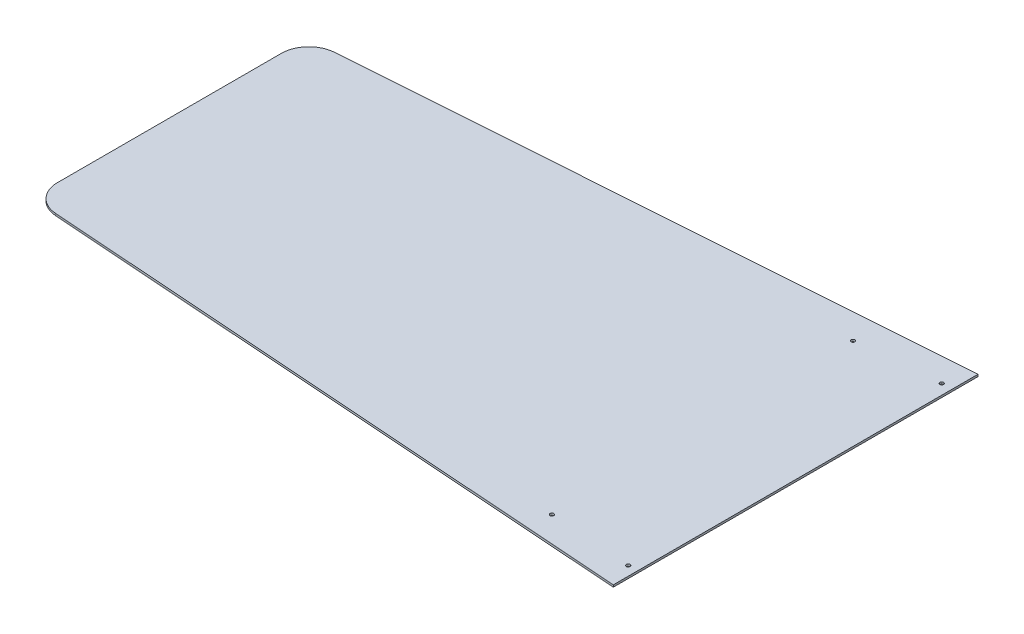
ISO-10303-21;
HEADER;
FILE_DESCRIPTION(('STEP AP214'),'2;1');
FILE_NAME('part.step','',(''),(''),'','','');
FILE_SCHEMA(('AUTOMOTIVE_DESIGN { 1 0 10303 214 1 1 1 1 }'));
ENDSEC;
DATA;
#1=APPLICATION_CONTEXT('core data for automotive mechanical design processes');
#2=APPLICATION_PROTOCOL_DEFINITION('international standard','automotive_design',2000,#1);
#3=PRODUCT_CONTEXT('',#1,'mechanical');
#4=PRODUCT('Part','Part','',(#3));
#5=PRODUCT_RELATED_PRODUCT_CATEGORY('part','',(#4));
#6=PRODUCT_DEFINITION_FORMATION('','',#4);
#7=PRODUCT_DEFINITION_CONTEXT('part definition',#1,'design');
#8=PRODUCT_DEFINITION('design','',#6,#7);
#9=PRODUCT_DEFINITION_SHAPE('','',#8);
#10=(LENGTH_UNIT() NAMED_UNIT(*) SI_UNIT(.MILLI.,.METRE.));
#11=(NAMED_UNIT(*) PLANE_ANGLE_UNIT() SI_UNIT($,.RADIAN.));
#12=(NAMED_UNIT(*) SI_UNIT($,.STERADIAN.) SOLID_ANGLE_UNIT());
#13=UNCERTAINTY_MEASURE_WITH_UNIT(LENGTH_MEASURE(1.E-05),#10,'distance_accuracy_value','');
#14=(GEOMETRIC_REPRESENTATION_CONTEXT(3) GLOBAL_UNCERTAINTY_ASSIGNED_CONTEXT((#13)) GLOBAL_UNIT_ASSIGNED_CONTEXT((#10,
#11,#12)) REPRESENTATION_CONTEXT('',''));
#15=CARTESIAN_POINT('',(0.,0.,0.));
#16=DIRECTION('',(0.,0.,1.));
#17=DIRECTION('',(1.,0.,0.));
#18=AXIS2_PLACEMENT_3D('',#15,#16,#17);
#19=CARTESIAN_POINT('',(37.1501180004836,3.,-202.653579857177));
#20=DIRECTION('',(0.0712470499879097,0.,0.997458699830735));
#21=DIRECTION('',(0.997458699830735,0.,-0.0712470499879097));
#22=AXIS2_PLACEMENT_3D('',#19,#20,#21);
#23=PLANE('',#22);
#24=DIRECTION('',(-0.997458699830735,0.,0.0712470499879097));
#25=VECTOR('',#24,1.);
#26=CARTESIAN_POINT('',(37.1501180004836,0.,-202.653579857177));
#27=LINE('',#26,#25);
#28=CARTESIAN_POINT('',(910.,0.,-265.));
#29=VERTEX_POINT('',#28);
#30=CARTESIAN_POINT('',(37.1501180004836,0.,-202.653579857177));
#31=VERTEX_POINT('',#30);
#32=EDGE_CURVE('E122',#29,#31,#27,.T.);
#33=ORIENTED_EDGE('',*,*,#32,.T.);
#34=DIRECTION('',(0.,-1.,0.));
#35=VECTOR('',#34,1.);
#36=CARTESIAN_POINT('',(37.1501180004836,3.,-202.653579857177));
#37=LINE('',#36,#35);
#38=CARTESIAN_POINT('',(37.1501180004836,3.,-202.653579857177));
#39=VERTEX_POINT('',#38);
#40=EDGE_CURVE('E11',#39,#31,#37,.T.);
#41=ORIENTED_EDGE('',*,*,#40,.F.);
#42=DIRECTION('',(-0.997458699830735,0.,0.0712470499879097));
#43=VECTOR('',#42,1.);
#44=CARTESIAN_POINT('',(37.1501180004836,3.,-202.653579857177));
#45=LINE('',#44,#43);
#46=CARTESIAN_POINT('',(910.,3.,-265.));
#47=VERTEX_POINT('',#46);
#48=EDGE_CURVE('E132',#47,#39,#45,.T.);
#49=ORIENTED_EDGE('',*,*,#48,.F.);
#50=DIRECTION('',(0.,-1.,0.));
#51=VECTOR('',#50,1.);
#52=CARTESIAN_POINT('',(910.,3.,-265.));
#53=LINE('',#52,#51);
#54=EDGE_CURVE('E118',#47,#29,#53,.T.);
#55=ORIENTED_EDGE('',*,*,#54,.T.);
#56=EDGE_LOOP('',(#33,#41,#49,#55));
#57=FACE_BOUND('',#56,.T.);
#58=ADVANCED_FACE('F36',(#57),#23,.F.);
#59=CARTESIAN_POINT('',(40.,3.,-162.755231863948));
#60=DIRECTION('',(0.,-1.,0.));
#61=DIRECTION('',(0.,0.,-1.));
#62=AXIS2_PLACEMENT_3D('',#59,#60,#61);
#63=CYLINDRICAL_SURFACE('',#62,39.9999999999999);
#64=CARTESIAN_POINT('',(40.,0.,-162.755231863948));
#65=DIRECTION('',(0.,1.,0.));
#66=DIRECTION('',(0.,0.,-1.));
#67=AXIS2_PLACEMENT_3D('',#64,#65,#66);
#68=CIRCLE('',#67,39.9999999999999);
#69=CARTESIAN_POINT('',(0.,0.,-162.755231863948));
#70=VERTEX_POINT('',#69);
#71=EDGE_CURVE('E125',#31,#70,#68,.T.);
#72=ORIENTED_EDGE('',*,*,#71,.T.);
#73=DIRECTION('',(0.,-1.,0.));
#74=VECTOR('',#73,1.);
#75=CARTESIAN_POINT('',(0.,3.,-162.755231863948));
#76=LINE('',#75,#74);
#77=CARTESIAN_POINT('',(0.,3.,-162.755231863948));
#78=VERTEX_POINT('',#77);
#79=EDGE_CURVE('E45',#78,#70,#76,.T.);
#80=ORIENTED_EDGE('',*,*,#79,.F.);
#81=CARTESIAN_POINT('',(40.,3.,-162.755231863948));
#82=DIRECTION('',(0.,1.,0.));
#83=DIRECTION('',(0.,0.,-1.));
#84=AXIS2_PLACEMENT_3D('',#81,#82,#83);
#85=CIRCLE('',#84,39.9999999999999);
#86=EDGE_CURVE('E91',#39,#78,#85,.T.);
#87=ORIENTED_EDGE('',*,*,#86,.F.);
#88=ORIENTED_EDGE('',*,*,#40,.T.);
#89=EDGE_LOOP('',(#72,#80,#87,#88));
#90=FACE_BOUND('',#89,.T.);
#91=ADVANCED_FACE('F167',(#90),#63,.T.);
#92=CARTESIAN_POINT('',(0.,3.,-162.755231863948));
#93=DIRECTION('',(1.,0.,0.));
#94=DIRECTION('',(0.,0.,-1.));
#95=AXIS2_PLACEMENT_3D('',#92,#93,#94);
#96=PLANE('',#95);
#97=DIRECTION('',(0.,0.,1.));
#98=VECTOR('',#97,1.);
#99=CARTESIAN_POINT('',(0.,0.,-162.755231863948));
#100=LINE('',#99,#98);
#101=CARTESIAN_POINT('',(1.11022302462516E-13,0.,162.755231863948));
#102=VERTEX_POINT('',#101);
#103=EDGE_CURVE('E127',#70,#102,#100,.T.);
#104=ORIENTED_EDGE('',*,*,#103,.T.);
#105=DIRECTION('',(0.,-1.,0.));
#106=VECTOR('',#105,1.);
#107=CARTESIAN_POINT('',(1.11022302462516E-13,3.,162.755231863948));
#108=LINE('',#107,#106);
#109=CARTESIAN_POINT('',(1.11022302462516E-13,3.,162.755231863948));
#110=VERTEX_POINT('',#109);
#111=EDGE_CURVE('E113',#110,#102,#108,.T.);
#112=ORIENTED_EDGE('',*,*,#111,.F.);
#113=DIRECTION('',(0.,0.,1.));
#114=VECTOR('',#113,1.);
#115=CARTESIAN_POINT('',(0.,3.,-162.755231863948));
#116=LINE('',#115,#114);
#117=EDGE_CURVE('E104',#78,#110,#116,.T.);
#118=ORIENTED_EDGE('',*,*,#117,.F.);
#119=ORIENTED_EDGE('',*,*,#79,.T.);
#120=EDGE_LOOP('',(#104,#112,#118,#119));
#121=FACE_BOUND('',#120,.T.);
#122=ADVANCED_FACE('F172',(#121),#96,.F.);
#123=CARTESIAN_POINT('',(40.,3.,162.755231863948));
#124=DIRECTION('',(0.,-1.,0.));
#125=DIRECTION('',(0.,0.,-1.));
#126=AXIS2_PLACEMENT_3D('',#123,#124,#125);
#127=CYLINDRICAL_SURFACE('',#126,39.9999999999999);
#128=CARTESIAN_POINT('',(40.,0.,162.755231863948));
#129=DIRECTION('',(0.,1.,0.));
#130=DIRECTION('',(0.,0.,1.));
#131=AXIS2_PLACEMENT_3D('',#128,#129,#130);
#132=CIRCLE('',#131,39.9999999999999);
#133=CARTESIAN_POINT('',(37.1501180004836,0.,202.653579857177));
#134=VERTEX_POINT('',#133);
#135=EDGE_CURVE('E112',#102,#134,#132,.T.);
#136=ORIENTED_EDGE('',*,*,#135,.T.);
#137=DIRECTION('',(0.,-1.,0.));
#138=VECTOR('',#137,1.);
#139=CARTESIAN_POINT('',(37.1501180004836,3.,202.653579857177));
#140=LINE('',#139,#138);
#141=CARTESIAN_POINT('',(37.1501180004836,3.,202.653579857177));
#142=VERTEX_POINT('',#141);
#143=EDGE_CURVE('E109',#142,#134,#140,.T.);
#144=ORIENTED_EDGE('',*,*,#143,.F.);
#145=CARTESIAN_POINT('',(40.,3.,162.755231863948));
#146=DIRECTION('',(0.,1.,0.));
#147=DIRECTION('',(0.,0.,1.));
#148=AXIS2_PLACEMENT_3D('',#145,#146,#147);
#149=CIRCLE('',#148,39.9999999999999);
#150=EDGE_CURVE('E98',#110,#142,#149,.T.);
#151=ORIENTED_EDGE('',*,*,#150,.F.);
#152=ORIENTED_EDGE('',*,*,#111,.T.);
#153=EDGE_LOOP('',(#136,#144,#151,#152));
#154=FACE_BOUND('',#153,.T.);
#155=ADVANCED_FACE('F110',(#154),#127,.T.);
#156=CARTESIAN_POINT('',(37.1501180004836,3.,202.653579857177));
#157=DIRECTION('',(0.0712470499879097,0.,-0.997458699830735));
#158=DIRECTION('',(-0.997458699830735,0.,-0.0712470499879097));
#159=AXIS2_PLACEMENT_3D('',#156,#157,#158);
#160=PLANE('',#159);
#161=DIRECTION('',(0.997458699830735,0.,0.0712470499879097));
#162=VECTOR('',#161,1.);
#163=CARTESIAN_POINT('',(37.1501180004836,0.,202.653579857177));
#164=LINE('',#163,#162);
#165=CARTESIAN_POINT('',(910.,0.,265.));
#166=VERTEX_POINT('',#165);
#167=EDGE_CURVE('E77',#134,#166,#164,.T.);
#168=ORIENTED_EDGE('',*,*,#167,.T.);
#169=DIRECTION('',(0.,-1.,0.));
#170=VECTOR('',#169,1.);
#171=CARTESIAN_POINT('',(910.,3.,265.));
#172=LINE('',#171,#170);
#173=CARTESIAN_POINT('',(910.,3.,265.));
#174=VERTEX_POINT('',#173);
#175=EDGE_CURVE('E114',#174,#166,#172,.T.);
#176=ORIENTED_EDGE('',*,*,#175,.F.);
#177=DIRECTION('',(0.997458699830735,0.,0.0712470499879097));
#178=VECTOR('',#177,1.);
#179=CARTESIAN_POINT('',(37.1501180004836,3.,202.653579857177));
#180=LINE('',#179,#178);
#181=EDGE_CURVE('E102',#142,#174,#180,.T.);
#182=ORIENTED_EDGE('',*,*,#181,.F.);
#183=ORIENTED_EDGE('',*,*,#143,.T.);
#184=EDGE_LOOP('',(#168,#176,#182,#183));
#185=FACE_BOUND('',#184,.T.);
#186=ADVANCED_FACE('F116',(#185),#160,.F.);
#187=CARTESIAN_POINT('',(910.,3.,-265.));
#188=DIRECTION('',(-1.,0.,0.));
#189=DIRECTION('',(0.,0.,1.));
#190=AXIS2_PLACEMENT_3D('',#187,#188,#189);
#191=PLANE('',#190);
#192=DIRECTION('',(0.,0.,-1.));
#193=VECTOR('',#192,1.);
#194=CARTESIAN_POINT('',(910.,0.,-265.));
#195=LINE('',#194,#193);
#196=EDGE_CURVE('E83',#166,#29,#195,.T.);
#197=ORIENTED_EDGE('',*,*,#196,.T.);
#198=ORIENTED_EDGE('',*,*,#54,.F.);
#199=DIRECTION('',(0.,0.,-1.));
#200=VECTOR('',#199,1.);
#201=CARTESIAN_POINT('',(910.,3.,-265.));
#202=LINE('',#201,#200);
#203=EDGE_CURVE('E54',#174,#47,#202,.T.);
#204=ORIENTED_EDGE('',*,*,#203,.F.);
#205=ORIENTED_EDGE('',*,*,#175,.T.);
#206=EDGE_LOOP('',(#197,#198,#204,#205));
#207=FACE_BOUND('',#206,.T.);
#208=ADVANCED_FACE('F197',(#207),#191,.F.);
#209=CARTESIAN_POINT('',(40.,3.,162.755231863948));
#210=DIRECTION('',(0.,1.,0.));
#211=DIRECTION('',(0.,0.,1.));
#212=AXIS2_PLACEMENT_3D('',#209,#210,#211);
#213=PLANE('',#212);
#214=CARTESIAN_POINT('',(895.061762744719,3.,-227.273960294779));
#215=DIRECTION('',(0.,1.,0.));
#216=DIRECTION('',(0.,0.,1.));
#217=AXIS2_PLACEMENT_3D('',#214,#215,#216);
#218=CIRCLE('',#217,2.75000000000004);
#219=CARTESIAN_POINT('',(895.061762744719,3.,-224.523960294779));
#220=VERTEX_POINT('',#219);
#221=EDGE_CURVE('E185',#220,#220,#218,.T.);
#222=ORIENTED_EDGE('',*,*,#221,.F.);
#223=EDGE_LOOP('',(#222));
#224=FACE_BOUND('',#223,.T.);
#225=CARTESIAN_POINT('',(776.998649919802,3.,-216.25987623897));
#226=DIRECTION('',(0.,1.,0.));
#227=DIRECTION('',(0.,0.,1.));
#228=AXIS2_PLACEMENT_3D('',#225,#226,#227);
#229=CIRCLE('',#228,2.75000000000004);
#230=CARTESIAN_POINT('',(776.998649919802,3.,-213.50987623897));
#231=VERTEX_POINT('',#230);
#232=EDGE_CURVE('E187',#231,#231,#229,.T.);
#233=ORIENTED_EDGE('',*,*,#232,.F.);
#234=EDGE_LOOP('',(#233));
#235=FACE_BOUND('',#234,.T.);
#236=CARTESIAN_POINT('',(896.405474423375,3.,229.771178815229));
#237=DIRECTION('',(0.,1.,0.));
#238=DIRECTION('',(0.,0.,1.));
#239=AXIS2_PLACEMENT_3D('',#236,#237,#238);
#240=CIRCLE('',#239,2.75000000000004);
#241=CARTESIAN_POINT('',(896.405474423375,3.,232.521178815229));
#242=VERTEX_POINT('',#241);
#243=EDGE_CURVE('E184',#242,#242,#240,.T.);
#244=ORIENTED_EDGE('',*,*,#243,.F.);
#245=EDGE_LOOP('',(#244));
#246=FACE_BOUND('',#245,.T.);
#247=CARTESIAN_POINT('',(776.998649919802,3.,221.137424034966));
#248=DIRECTION('',(0.,1.,0.));
#249=DIRECTION('',(0.,0.,1.));
#250=AXIS2_PLACEMENT_3D('',#247,#248,#249);
#251=CIRCLE('',#250,2.75000000000004);
#252=CARTESIAN_POINT('',(776.998649919802,3.,223.887424034966));
#253=VERTEX_POINT('',#252);
#254=EDGE_CURVE('E142',#253,#253,#251,.T.);
#255=ORIENTED_EDGE('',*,*,#254,.F.);
#256=EDGE_LOOP('',(#255));
#257=FACE_BOUND('',#256,.T.);
#258=ORIENTED_EDGE('',*,*,#48,.T.);
#259=ORIENTED_EDGE('',*,*,#86,.T.);
#260=ORIENTED_EDGE('',*,*,#117,.T.);
#261=ORIENTED_EDGE('',*,*,#150,.T.);
#262=ORIENTED_EDGE('',*,*,#181,.T.);
#263=ORIENTED_EDGE('',*,*,#203,.T.);
#264=EDGE_LOOP('',(#258,#259,#260,#261,#262,#263));
#265=FACE_BOUND('',#264,.T.);
#266=ADVANCED_FACE('F100',(#224,#235,#246,#257,#265),#213,.T.);
#267=CARTESIAN_POINT('',(40.,0.,162.755231863948));
#268=DIRECTION('',(0.,1.,0.));
#269=DIRECTION('',(0.,0.,1.));
#270=AXIS2_PLACEMENT_3D('',#267,#268,#269);
#271=PLANE('',#270);
#272=CARTESIAN_POINT('',(895.061762744719,0.,-227.273960294779));
#273=DIRECTION('',(0.,1.,0.));
#274=DIRECTION('',(0.,0.,1.));
#275=AXIS2_PLACEMENT_3D('',#272,#273,#274);
#276=CIRCLE('',#275,2.75000000000004);
#277=CARTESIAN_POINT('',(895.061762744719,0.,-224.523960294779));
#278=VERTEX_POINT('',#277);
#279=EDGE_CURVE('E39',#278,#278,#276,.T.);
#280=ORIENTED_EDGE('',*,*,#279,.T.);
#281=EDGE_LOOP('',(#280));
#282=FACE_BOUND('',#281,.T.);
#283=CARTESIAN_POINT('',(776.998649919802,0.,-216.25987623897));
#284=DIRECTION('',(0.,1.,0.));
#285=DIRECTION('',(0.,0.,1.));
#286=AXIS2_PLACEMENT_3D('',#283,#284,#285);
#287=CIRCLE('',#286,2.75000000000004);
#288=CARTESIAN_POINT('',(776.998649919802,0.,-213.50987623897));
#289=VERTEX_POINT('',#288);
#290=EDGE_CURVE('E144',#289,#289,#287,.T.);
#291=ORIENTED_EDGE('',*,*,#290,.T.);
#292=EDGE_LOOP('',(#291));
#293=FACE_BOUND('',#292,.T.);
#294=CARTESIAN_POINT('',(896.405474423375,0.,229.771178815229));
#295=DIRECTION('',(0.,1.,0.));
#296=DIRECTION('',(0.,0.,1.));
#297=AXIS2_PLACEMENT_3D('',#294,#295,#296);
#298=CIRCLE('',#297,2.75000000000004);
#299=CARTESIAN_POINT('',(896.405474423375,0.,232.521178815229));
#300=VERTEX_POINT('',#299);
#301=EDGE_CURVE('E141',#300,#300,#298,.T.);
#302=ORIENTED_EDGE('',*,*,#301,.T.);
#303=EDGE_LOOP('',(#302));
#304=FACE_BOUND('',#303,.T.);
#305=CARTESIAN_POINT('',(776.998649919802,0.,221.137424034966));
#306=DIRECTION('',(0.,1.,0.));
#307=DIRECTION('',(0.,0.,1.));
#308=AXIS2_PLACEMENT_3D('',#305,#306,#307);
#309=CIRCLE('',#308,2.75000000000004);
#310=CARTESIAN_POINT('',(776.998649919802,0.,223.887424034966));
#311=VERTEX_POINT('',#310);
#312=EDGE_CURVE('E138',#311,#311,#309,.T.);
#313=ORIENTED_EDGE('',*,*,#312,.T.);
#314=EDGE_LOOP('',(#313));
#315=FACE_BOUND('',#314,.T.);
#316=ORIENTED_EDGE('',*,*,#32,.F.);
#317=ORIENTED_EDGE('',*,*,#196,.F.);
#318=ORIENTED_EDGE('',*,*,#167,.F.);
#319=ORIENTED_EDGE('',*,*,#135,.F.);
#320=ORIENTED_EDGE('',*,*,#103,.F.);
#321=ORIENTED_EDGE('',*,*,#71,.F.);
#322=EDGE_LOOP('',(#316,#317,#318,#319,#320,#321));
#323=FACE_BOUND('',#322,.T.);
#324=ADVANCED_FACE('F151',(#282,#293,#304,#315,#323),#271,.F.);
#325=CARTESIAN_POINT('',(776.998649919802,-7.00000000000001,221.137424034966));
#326=DIRECTION('',(0.,1.,0.));
#327=DIRECTION('',(0.,0.,1.));
#328=AXIS2_PLACEMENT_3D('',#325,#326,#327);
#329=CYLINDRICAL_SURFACE('',#328,2.75000000000004);
#330=ORIENTED_EDGE('',*,*,#254,.T.);
#331=EDGE_LOOP('',(#330));
#332=FACE_BOUND('',#331,.T.);
#333=ORIENTED_EDGE('',*,*,#312,.F.);
#334=EDGE_LOOP('',(#333));
#335=FACE_BOUND('',#334,.T.);
#336=ADVANCED_FACE('F202',(#332,#335),#329,.F.);
#337=CARTESIAN_POINT('',(896.405474423375,-6.99999999999999,229.771178815229));
#338=DIRECTION('',(0.,1.,0.));
#339=DIRECTION('',(0.,0.,1.));
#340=AXIS2_PLACEMENT_3D('',#337,#338,#339);
#341=CYLINDRICAL_SURFACE('',#340,2.75000000000004);
#342=ORIENTED_EDGE('',*,*,#243,.T.);
#343=EDGE_LOOP('',(#342));
#344=FACE_BOUND('',#343,.T.);
#345=ORIENTED_EDGE('',*,*,#301,.F.);
#346=EDGE_LOOP('',(#345));
#347=FACE_BOUND('',#346,.T.);
#348=ADVANCED_FACE('F161',(#344,#347),#341,.F.);
#349=CARTESIAN_POINT('',(776.998649919802,-7.00000000000001,-216.25987623897));
#350=DIRECTION('',(0.,1.,0.));
#351=DIRECTION('',(0.,0.,1.));
#352=AXIS2_PLACEMENT_3D('',#349,#350,#351);
#353=CYLINDRICAL_SURFACE('',#352,2.75000000000004);
#354=ORIENTED_EDGE('',*,*,#232,.T.);
#355=EDGE_LOOP('',(#354));
#356=FACE_BOUND('',#355,.T.);
#357=ORIENTED_EDGE('',*,*,#290,.F.);
#358=EDGE_LOOP('',(#357));
#359=FACE_BOUND('',#358,.T.);
#360=ADVANCED_FACE('F155',(#356,#359),#353,.F.);
#361=CARTESIAN_POINT('',(895.061762744719,-6.99999999999999,-227.273960294779));
#362=DIRECTION('',(0.,1.,0.));
#363=DIRECTION('',(0.,0.,1.));
#364=AXIS2_PLACEMENT_3D('',#361,#362,#363);
#365=CYLINDRICAL_SURFACE('',#364,2.75000000000004);
#366=ORIENTED_EDGE('',*,*,#221,.T.);
#367=EDGE_LOOP('',(#366));
#368=FACE_BOUND('',#367,.T.);
#369=ORIENTED_EDGE('',*,*,#279,.F.);
#370=EDGE_LOOP('',(#369));
#371=FACE_BOUND('',#370,.T.);
#372=ADVANCED_FACE('F153',(#368,#371),#365,.F.);
#373=CLOSED_SHELL('',(#58,#91,#122,#155,#186,#208,#266,#324,#336,#348,#360,#372));
#374=MANIFOLD_SOLID_BREP('B2',#373);
#375=ADVANCED_BREP_SHAPE_REPRESENTATION('',(#18,#374),#14);
#376=SHAPE_DEFINITION_REPRESENTATION(#9,#375);
ENDSEC;
END-ISO-10303-21;
